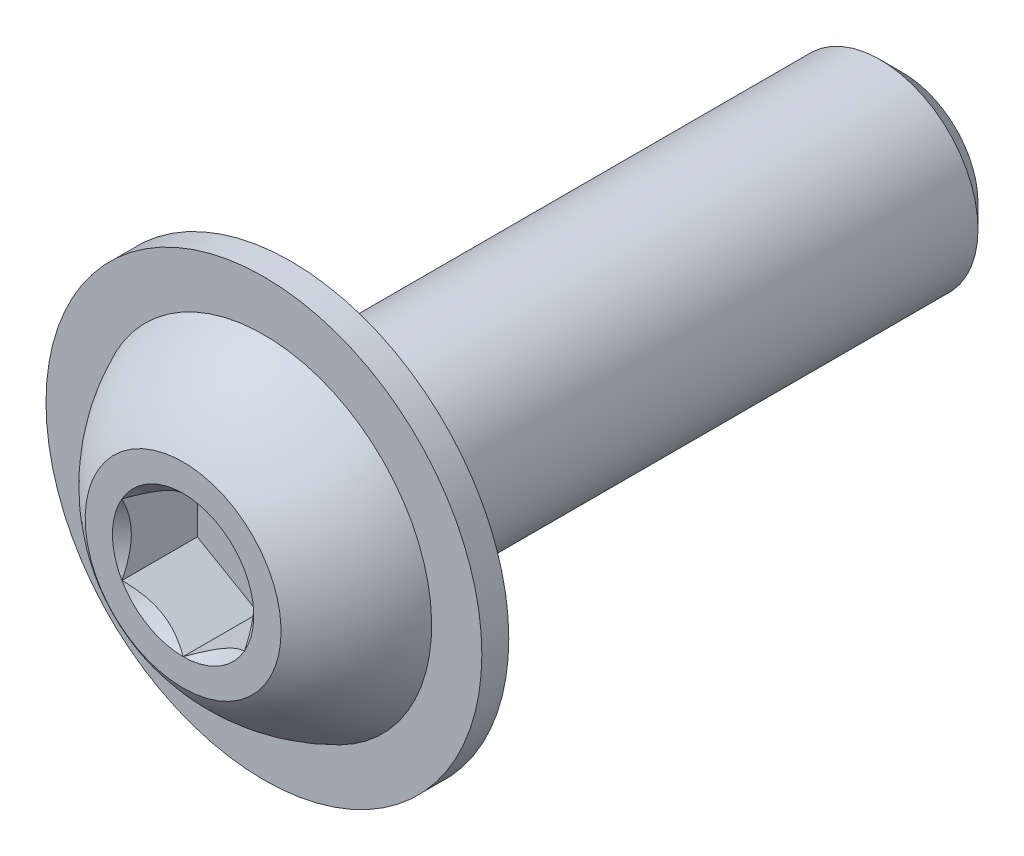
ISO-10303-21;
HEADER;
FILE_DESCRIPTION(('STEP AP214'),'2;1');
FILE_NAME('part.step','',(''),(''),'','','');
FILE_SCHEMA(('AUTOMOTIVE_DESIGN { 1 0 10303 214 1 1 1 1 }'));
ENDSEC;
DATA;
#1=APPLICATION_CONTEXT('core data for automotive mechanical design processes');
#2=APPLICATION_PROTOCOL_DEFINITION('international standard','automotive_design',2000,#1);
#3=PRODUCT_CONTEXT('',#1,'mechanical');
#4=PRODUCT('Part','Part','',(#3));
#5=PRODUCT_RELATED_PRODUCT_CATEGORY('part','',(#4));
#6=PRODUCT_DEFINITION_FORMATION('','',#4);
#7=PRODUCT_DEFINITION_CONTEXT('part definition',#1,'design');
#8=PRODUCT_DEFINITION('design','',#6,#7);
#9=PRODUCT_DEFINITION_SHAPE('','',#8);
#10=(LENGTH_UNIT() NAMED_UNIT(*) SI_UNIT(.MILLI.,.METRE.));
#11=(NAMED_UNIT(*) PLANE_ANGLE_UNIT() SI_UNIT($,.RADIAN.));
#12=(NAMED_UNIT(*) SI_UNIT($,.STERADIAN.) SOLID_ANGLE_UNIT());
#13=UNCERTAINTY_MEASURE_WITH_UNIT(LENGTH_MEASURE(1.E-05),#10,'distance_accuracy_value','');
#14=(GEOMETRIC_REPRESENTATION_CONTEXT(3) GLOBAL_UNCERTAINTY_ASSIGNED_CONTEXT((#13)) GLOBAL_UNIT_ASSIGNED_CONTEXT((#10,
#11,#12)) REPRESENTATION_CONTEXT('',''));
#15=CARTESIAN_POINT('',(0.,0.,0.));
#16=DIRECTION('',(0.,0.,1.));
#17=DIRECTION('',(1.,0.,0.));
#18=AXIS2_PLACEMENT_3D('',#15,#16,#17);
#19=CARTESIAN_POINT('',(0.,4.,-14.7));
#20=DIRECTION('',(0.,0.,1.));
#21=DIRECTION('',(1.,0.,0.));
#22=AXIS2_PLACEMENT_3D('',#19,#20,#21);
#23=PLANE('',#22);
#24=CARTESIAN_POINT('',(0.,0.,-14.7));
#25=DIRECTION('',(0.,0.,1.));
#26=DIRECTION('',(1.,0.,0.));
#27=AXIS2_PLACEMENT_3D('',#24,#25,#26);
#28=CIRCLE('',#27,3.0625);
#29=CARTESIAN_POINT('',(3.0625,0.,-14.7));
#30=VERTEX_POINT('',#29);
#31=EDGE_CURVE('E62',#30,#30,#28,.F.);
#32=ORIENTED_EDGE('',*,*,#31,.T.);
#33=EDGE_LOOP('',(#32));
#34=FACE_BOUND('',#33,.T.);
#35=ADVANCED_FACE('F47',(#34),#23,.F.);
#36=CARTESIAN_POINT('',(0.,0.,14.7));
#37=DIRECTION('',(0.,0.,1.));
#38=DIRECTION('',(1.,0.,0.));
#39=AXIS2_PLACEMENT_3D('',#36,#37,#38);
#40=CYLINDRICAL_SURFACE('',#39,4.);
#41=CARTESIAN_POINT('',(0.,0.,-13.7625));
#42=DIRECTION('',(0.,0.,1.));
#43=DIRECTION('',(1.,0.,0.));
#44=AXIS2_PLACEMENT_3D('',#41,#42,#43);
#45=CIRCLE('',#44,4.);
#46=CARTESIAN_POINT('',(4.,0.,-13.7625));
#47=VERTEX_POINT('',#46);
#48=EDGE_CURVE('E216',#47,#47,#45,.T.);
#49=ORIENTED_EDGE('',*,*,#48,.T.);
#50=EDGE_LOOP('',(#49));
#51=FACE_BOUND('',#50,.T.);
#52=CARTESIAN_POINT('',(0.,0.,10.3));
#53=DIRECTION('',(0.,0.,1.));
#54=DIRECTION('',(1.,0.,0.));
#55=AXIS2_PLACEMENT_3D('',#52,#53,#54);
#56=CIRCLE('',#55,4.);
#57=CARTESIAN_POINT('',(4.,0.,10.3));
#58=VERTEX_POINT('',#57);
#59=EDGE_CURVE('E212',#58,#58,#56,.T.);
#60=ORIENTED_EDGE('',*,*,#59,.F.);
#61=EDGE_LOOP('',(#60));
#62=FACE_BOUND('',#61,.T.);
#63=ADVANCED_FACE('F227',(#51,#62),#40,.T.);
#64=CARTESIAN_POINT('',(0.,0.,-13.7625));
#65=DIRECTION('',(0.,0.,1.));
#66=DIRECTION('',(1.,0.,0.));
#67=AXIS2_PLACEMENT_3D('',#64,#65,#66);
#68=CONICAL_SURFACE('',#67,4.,0.78539816339745);
#69=ORIENTED_EDGE('',*,*,#31,.F.);
#70=EDGE_LOOP('',(#69));
#71=FACE_BOUND('',#70,.T.);
#72=ORIENTED_EDGE('',*,*,#48,.F.);
#73=EDGE_LOOP('',(#72));
#74=FACE_BOUND('',#73,.T.);
#75=ADVANCED_FACE('F49',(#71,#74),#68,.T.);
#76=CARTESIAN_POINT('',(0.,-8.9,10.3));
#77=DIRECTION('',(0.,0.,1.));
#78=DIRECTION('',(0.,-1.,0.));
#79=AXIS2_PLACEMENT_3D('',#76,#77,#78);
#80=PLANE('',#79);
#81=CARTESIAN_POINT('',(0.,0.,10.3));
#82=DIRECTION('',(0.,0.,1.));
#83=DIRECTION('',(0.,-1.,0.));
#84=AXIS2_PLACEMENT_3D('',#81,#82,#83);
#85=CIRCLE('',#84,8.9);
#86=CARTESIAN_POINT('',(0.,-8.9,10.3));
#87=VERTEX_POINT('',#86);
#88=EDGE_CURVE('E204',#87,#87,#85,.T.);
#89=ORIENTED_EDGE('',*,*,#88,.F.);
#90=EDGE_LOOP('',(#89));
#91=FACE_BOUND('',#90,.T.);
#92=ORIENTED_EDGE('',*,*,#59,.T.);
#93=EDGE_LOOP('',(#92));
#94=FACE_BOUND('',#93,.T.);
#95=ADVANCED_FACE('F226',(#91,#94),#80,.F.);
#96=CARTESIAN_POINT('',(0.,0.,8.36477272727273));
#97=DIRECTION('',(0.,0.,1.));
#98=DIRECTION('',(0.,-1.,0.));
#99=AXIS2_PLACEMENT_3D('',#96,#97,#98);
#100=SPHERICAL_SURFACE('',#99,7.49233639108038);
#101=CARTESIAN_POINT('',(0.,0.,14.7));
#102=DIRECTION('',(0.,0.,1.));
#103=DIRECTION('',(0.,-1.,0.));
#104=AXIS2_PLACEMENT_3D('',#101,#102,#103);
#105=CIRCLE('',#104,4.);
#106=CARTESIAN_POINT('',(0.,-4.,14.7));
#107=VERTEX_POINT('',#106);
#108=EDGE_CURVE('E208',#107,#107,#105,.T.);
#109=CARTESIAN_POINT('',(0.,0.,11.4));
#110=DIRECTION('',(0.,0.,1.));
#111=DIRECTION('',(0.,-1.,0.));
#112=AXIS2_PLACEMENT_3D('',#109,#110,#111);
#113=CIRCLE('',#112,6.85);
#114=CARTESIAN_POINT('',(0.,-6.85,11.4));
#115=VERTEX_POINT('',#114);
#116=EDGE_CURVE('E196',#115,#115,#113,.T.);
#117=CARTESIAN_POINT('',(0.,-4.,14.7));
#118=CARTESIAN_POINT('',(0.,-4.03896925899167,14.675395255813));
#119=CARTESIAN_POINT('',(0.,-4.07771143871572,14.6504308650469));
#120=CARTESIAN_POINT('',(0.,-4.15472857241435,14.5997914822059));
#121=CARTESIAN_POINT('',(0.,-4.19300352638891,14.5741164901311));
#122=CARTESIAN_POINT('',(0.,-4.2690731413743,14.5220645965225));
#123=CARTESIAN_POINT('',(0.,-4.30686780238512,14.4956876949888));
#124=CARTESIAN_POINT('',(0.,-4.38196397041198,14.4422409781677));
#125=CARTESIAN_POINT('',(0.,-4.41926547742802,14.4151711628803));
#126=CARTESIAN_POINT('',(0.,-4.49336263294272,14.3603478328389));
#127=CARTESIAN_POINT('',(0.,-4.53015828144137,14.3325943180849));
#128=CARTESIAN_POINT('',(0.,-4.60323119071712,14.2764130408691));
#129=CARTESIAN_POINT('',(0.,-4.63950845149421,14.2479852784074));
#130=CARTESIAN_POINT('',(0.,-4.71153223182666,14.1904651858863));
#131=CARTESIAN_POINT('',(0.,-4.74727875138204,14.161372855827));
#132=CARTESIAN_POINT('',(0.,-4.8182288767215,14.1025335348572));
#133=CARTESIAN_POINT('',(0.,-4.85343248250559,14.0727865439467));
#134=CARTESIAN_POINT('',(0.,-4.92328479256995,14.0126480308601));
#135=CARTESIAN_POINT('',(0.,-4.95793349685022,13.9822565086839));
#136=CARTESIAN_POINT('',(0.,-5.02666420514821,13.9208392821547));
#137=CARTESIAN_POINT('',(0.,-5.06074620916592,13.8898135778016));
#138=CARTESIAN_POINT('',(0.,-5.12833191115163,13.827138551956));
#139=CARTESIAN_POINT('',(0.,-5.16183560911962,13.7954892304633));
#140=CARTESIAN_POINT('',(0.,-5.22825329014773,13.7315777477352));
#141=CARTESIAN_POINT('',(0.,-5.26116727320785,13.6993155864996));
#142=CARTESIAN_POINT('',(0.,-5.32639431637462,13.6341894103691));
#143=CARTESIAN_POINT('',(0.,-5.35870737648127,13.6013253954741));
#144=CARTESIAN_POINT('',(0.,-5.42272157032509,13.5350067030549));
#145=CARTESIAN_POINT('',(0.,-5.45442270406226,13.5015520255307));
#146=CARTESIAN_POINT('',(0.,-5.51720225012754,13.4340634000187));
#147=CARTESIAN_POINT('',(0.,-5.54828066245565,13.4000294520309));
#148=CARTESIAN_POINT('',(0.,-5.60980418271563,13.3313938750137));
#149=CARTESIAN_POINT('',(0.,-5.64024929064751,13.2967922459843));
#150=CARTESIAN_POINT('',(0.,-5.70049583478407,13.2270330896157));
#151=CARTESIAN_POINT('',(0.,-5.73029727098875,13.1918755622764));
#152=CARTESIAN_POINT('',(0.,-5.7892463235265,13.1210165813173));
#153=CARTESIAN_POINT('',(0.,-5.81839393985956,13.0853151276974));
#154=CARTESIAN_POINT('',(0.,-5.87602542715189,13.0133804514269));
#155=CARTESIAN_POINT('',(0.,-5.90450929811115,12.9771472287763));
#156=CARTESIAN_POINT('',(0.,-5.96080359517582,12.9041613527752));
#157=CARTESIAN_POINT('',(0.,-5.98861402128122,12.8674086994246));
#158=CARTESIAN_POINT('',(0.,-6.04355195848312,12.7933964772335));
#159=CARTESIAN_POINT('',(0.,-6.07067946957962,12.756136908393));
#160=CARTESIAN_POINT('',(0.,-6.12424233915867,12.6811235430497));
#161=CARTESIAN_POINT('',(0.,-6.15067769764121,12.643369746547));
#162=CARTESIAN_POINT('',(0.,-6.20284726008234,12.5673807820037));
#163=CARTESIAN_POINT('',(0.,-6.22858146404091,12.5291456139632));
#164=CARTESIAN_POINT('',(0.,-6.2793399542868,12.4522069263889));
#165=CARTESIAN_POINT('',(0.,-6.30436424057411,12.4135034068553));
#166=CARTESIAN_POINT('',(0.,-6.3536943740682,12.3356411958216));
#167=CARTESIAN_POINT('',(0.,-6.37800022127497,12.2964825043216));
#168=CARTESIAN_POINT('',(0.,-6.42588519987143,12.2177232838919));
#169=CARTESIAN_POINT('',(0.,-6.44946433126112,12.1781227549622));
#170=CARTESIAN_POINT('',(0.,-6.49588784885487,12.0984933446214));
#171=CARTESIAN_POINT('',(0.,-6.51873223505892,12.0584644632102));
#172=CARTESIAN_POINT('',(0.,-6.56367848347487,11.9779919788882));
#173=CARTESIAN_POINT('',(0.,-6.58578034568675,11.9375483759774));
#174=CARTESIAN_POINT('',(0.,-6.62923401880661,11.8562602202314));
#175=CARTESIAN_POINT('',(0.,-6.65058582971459,11.8154156673962));
#176=CARTESIAN_POINT('',(0.,-6.69253213337748,11.7333395222608));
#177=CARTESIAN_POINT('',(0.,-6.71312662613239,11.6921079299605));
#178=CARTESIAN_POINT('',(0.,-6.75355126567507,11.6092717393787));
#179=CARTESIAN_POINT('',(0.,-6.77338141246284,11.5676671410971));
#180=CARTESIAN_POINT('',(0.,-6.812270662889,11.4840991317936));
#181=CARTESIAN_POINT('',(0.,-6.8313297665274,11.4421357207716));
#182=CARTESIAN_POINT('',(0.,-6.85,11.4));
#183=B_SPLINE_CURVE_WITH_KNOTS('',3,(#117,#118,#119,#120,#121,#122,#123,#124,#125,#126,#127,
#128,#129,#130,#131,#132,#133,#134,#135,#136,#137,#138,#139,#140,#141,#142,#143,#144,#145,#146,
#147,#148,#149,#150,#151,#152,#153,#154,#155,#156,#157,#158,#159,#160,#161,#162,#163,#164,#165,
#166,#167,#168,#169,#170,#171,#172,#173,#174,#175,#176,#177,#178,#179,#180,#181,#182),
.UNSPECIFIED.,.F.,.F.,(4,2,2,2,2,2,2,2,2,2,2,2,2,2,2,2,2,2,2,2,2,2,2,2,2,2,2,2,2,2,2,2,4),(0.,
0.138258547689302,0.276517095378603,0.414775643067903,0.553034190757204,0.691292738446505,
0.829551286135806,0.967809833825107,1.10606838151441,1.24432692920371,1.38258547689301,
1.52084402458231,1.65910257227161,1.79736111996091,1.93561966765022,2.07387821533951,
2.21213676302882,2.35039531071812,2.48865385840742,2.62691240609672,2.76517095378602,
2.90342950147532,3.04168804916462,3.17994659685392,3.31820514454322,3.45646369223252,
3.59472223992183,3.73298078761113,3.87123933530043,4.00949788298973,4.14775643067903,
4.28601497836833,4.42427352605763),.UNSPECIFIED.);
#184=EDGE_CURVE('BSEAM236',#107,#115,#183,.T.);
#185=ORIENTED_EDGE('',*,*,#108,.F.);
#186=ORIENTED_EDGE('',*,*,#116,.T.);
#187=ORIENTED_EDGE('',*,*,#184,.T.);
#188=ORIENTED_EDGE('',*,*,#184,.F.);
#189=EDGE_LOOP('',(#185,#187,#186,#188));
#190=FACE_BOUND('',#189,.T.);
#191=ADVANCED_FACE('F236',(#190),#100,.T.);
#192=CARTESIAN_POINT('',(0.,-4.,14.7));
#193=DIRECTION('',(0.,0.,-1.));
#194=DIRECTION('',(0.,1.,0.));
#195=AXIS2_PLACEMENT_3D('',#192,#193,#194);
#196=PLANE('',#195);
#197=CARTESIAN_POINT('',(0.,0.,14.7));
#198=DIRECTION('',(0.,0.,1.));
#199=DIRECTION('',(1.,0.,0.));
#200=AXIS2_PLACEMENT_3D('',#197,#198,#199);
#201=CIRCLE('',#200,2.88675134594813);
#202=CARTESIAN_POINT('',(0.,2.88675134594813,14.7));
#203=VERTEX_POINT('',#202);
#204=CARTESIAN_POINT('',(-2.5,1.44337567297406,14.7));
#205=VERTEX_POINT('',#204);
#206=EDGE_CURVE('E153',#203,#205,#201,.T.);
#207=ORIENTED_EDGE('',*,*,#206,.F.);
#208=CARTESIAN_POINT('',(2.5,1.44337567297406,14.7));
#209=VERTEX_POINT('',#208);
#210=EDGE_CURVE('E148',#209,#203,#201,.T.);
#211=ORIENTED_EDGE('',*,*,#210,.F.);
#212=CARTESIAN_POINT('',(2.5,-1.44337567297407,14.7));
#213=VERTEX_POINT('',#212);
#214=EDGE_CURVE('E116',#213,#209,#201,.T.);
#215=ORIENTED_EDGE('',*,*,#214,.F.);
#216=CARTESIAN_POINT('',(0.,-2.88675134594813,14.7));
#217=VERTEX_POINT('',#216);
#218=EDGE_CURVE('E107',#217,#213,#201,.T.);
#219=ORIENTED_EDGE('',*,*,#218,.F.);
#220=CARTESIAN_POINT('',(-2.5,-1.44337567297407,14.7));
#221=VERTEX_POINT('',#220);
#222=EDGE_CURVE('E68',#221,#217,#201,.T.);
#223=ORIENTED_EDGE('',*,*,#222,.F.);
#224=EDGE_CURVE('E75',#205,#221,#201,.T.);
#225=ORIENTED_EDGE('',*,*,#224,.F.);
#226=EDGE_LOOP('',(#207,#211,#215,#219,#223,#225));
#227=FACE_BOUND('',#226,.T.);
#228=ORIENTED_EDGE('',*,*,#108,.T.);
#229=EDGE_LOOP('',(#228));
#230=FACE_BOUND('',#229,.T.);
#231=ADVANCED_FACE('F145',(#227,#230),#196,.F.);
#232=CARTESIAN_POINT('',(0.,0.,14.7));
#233=DIRECTION('',(0.,0.,1.));
#234=DIRECTION('',(0.,-1.,0.));
#235=AXIS2_PLACEMENT_3D('',#232,#233,#234);
#236=CYLINDRICAL_SURFACE('',#235,8.9);
#237=CARTESIAN_POINT('',(0.,0.,11.4));
#238=DIRECTION('',(0.,0.,1.));
#239=DIRECTION('',(0.,-1.,0.));
#240=AXIS2_PLACEMENT_3D('',#237,#238,#239);
#241=CIRCLE('',#240,8.9);
#242=CARTESIAN_POINT('',(0.,-8.9,11.4));
#243=VERTEX_POINT('',#242);
#244=EDGE_CURVE('E200',#243,#243,#241,.T.);
#245=ORIENTED_EDGE('',*,*,#244,.F.);
#246=EDGE_LOOP('',(#245));
#247=FACE_BOUND('',#246,.T.);
#248=ORIENTED_EDGE('',*,*,#88,.T.);
#249=EDGE_LOOP('',(#248));
#250=FACE_BOUND('',#249,.T.);
#251=ADVANCED_FACE('F251',(#247,#250),#236,.T.);
#252=CARTESIAN_POINT('',(0.,-6.85,11.4));
#253=DIRECTION('',(0.,0.,-1.));
#254=DIRECTION('',(0.,1.,0.));
#255=AXIS2_PLACEMENT_3D('',#252,#253,#254);
#256=PLANE('',#255);
#257=ORIENTED_EDGE('',*,*,#116,.F.);
#258=EDGE_LOOP('',(#257));
#259=FACE_BOUND('',#258,.T.);
#260=ORIENTED_EDGE('',*,*,#244,.T.);
#261=EDGE_LOOP('',(#260));
#262=FACE_BOUND('',#261,.T.);
#263=ADVANCED_FACE('F257',(#259,#262),#256,.F.);
#264=CARTESIAN_POINT('',(0.,0.,14.7));
#265=DIRECTION('',(0.,0.,1.));
#266=DIRECTION('',(1.,0.,0.));
#267=AXIS2_PLACEMENT_3D('',#264,#265,#266);
#268=CONICAL_SURFACE('',#267,2.88675134594813,0.78539816339745);
#269=ORIENTED_EDGE('',*,*,#214,.T.);
#270=CARTESIAN_POINT('',(2.5,-2.87868021616154,15.6259641937847));
#271=CARTESIAN_POINT('',(2.5,-2.80858751756355,15.5730547693995));
#272=CARTESIAN_POINT('',(2.5,-2.73810237384457,15.5206567848064));
#273=CARTESIAN_POINT('',(2.5,-2.59619238907469,15.4171126835152));
#274=CARTESIAN_POINT('',(2.5,-2.52476731657143,15.3659668843779));
#275=CARTESIAN_POINT('',(2.5,-2.38030019419698,15.2647924979814));
#276=CARTESIAN_POINT('',(2.5,-2.30724990359399,15.2147756377845));
#277=CARTESIAN_POINT('',(2.5,-2.15990937397294,15.1166088439155));
#278=CARTESIAN_POINT('',(2.5,-2.08561922308943,15.0684587783455));
#279=CARTESIAN_POINT('',(2.5,-1.93130274871408,14.971746559452));
#280=CARTESIAN_POINT('',(2.5,-1.8511916849785,14.9233189325373));
#281=CARTESIAN_POINT('',(2.5,-1.68912282627168,14.8296640597041));
#282=CARTESIAN_POINT('',(2.5,-1.60716527674864,14.7844363916948));
#283=CARTESIAN_POINT('',(2.5,-1.44137668632319,14.6981353746693));
#284=CARTESIAN_POINT('',(2.5,-1.35755175925796,14.6570503726636));
#285=CARTESIAN_POINT('',(2.5,-1.1876157775942,14.5799618661066));
#286=CARTESIAN_POINT('',(2.5,-1.10150577924729,14.5439560607346));
#287=CARTESIAN_POINT('',(2.5,-0.933895283730373,14.4809497442851));
#288=CARTESIAN_POINT('',(2.5,-0.852581486652411,14.4534577201431));
#289=CARTESIAN_POINT('',(2.5,-0.687996185051424,14.4049971144174));
#290=CARTESIAN_POINT('',(2.5,-0.604724546085161,14.384028982239));
#291=CARTESIAN_POINT('',(2.5,-0.438105786501648,14.350059995013));
#292=CARTESIAN_POINT('',(2.5,-0.35478695737788,14.3369226334436));
#293=CARTESIAN_POINT('',(2.5,-0.18725863826877,14.3188701943996));
#294=CARTESIAN_POINT('',(2.5,-0.103049303891731,14.3139537035302));
#295=CARTESIAN_POINT('',(2.5,0.0623819458555511,14.3127080743719));
#296=CARTESIAN_POINT('',(2.5,0.143601667742496,14.3160745517109));
#297=CARTESIAN_POINT('',(2.5,0.305344840533966,14.3305375923809));
#298=CARTESIAN_POINT('',(2.5,0.385868223029659,14.3416349066531));
#299=CARTESIAN_POINT('',(2.5,0.546999992477732,14.3711420785853));
#300=CARTESIAN_POINT('',(2.5,0.627585258156381,14.3896763768309));
#301=CARTESIAN_POINT('',(2.5,0.786991930978589,14.4330723320141));
#302=CARTESIAN_POINT('',(2.5,0.865813485110826,14.4579334595174));
#303=CARTESIAN_POINT('',(2.5,1.11399280220491,14.5455589112399));
#304=CARTESIAN_POINT('',(2.5,1.27984027529456,14.6183033354746));
#305=CARTESIAN_POINT('',(2.5,1.52253018655039,14.7395423452678));
#306=CARTESIAN_POINT('',(2.5,1.60256472908879,14.7820714512072));
#307=CARTESIAN_POINT('',(2.5,1.76081489282125,14.8703965241522));
#308=CARTESIAN_POINT('',(2.5,1.83903083842887,14.9161919024767));
#309=CARTESIAN_POINT('',(2.5,1.99000684607168,15.0080446787287));
#310=CARTESIAN_POINT('',(2.5,2.06284472030445,15.0539756354245));
#311=CARTESIAN_POINT('',(2.5,2.20727164736135,15.1477702453865));
#312=CARTESIAN_POINT('',(2.5,2.27886060500402,15.1956340450436));
#313=CARTESIAN_POINT('',(2.5,2.42037078548403,15.2925522363183));
#314=CARTESIAN_POINT('',(2.5,2.49030083172878,15.3415937983162));
#315=CARTESIAN_POINT('',(2.5,2.62920524991558,15.4409738351898));
#316=CARTESIAN_POINT('',(2.5,2.6981798793784,15.4913119497074));
#317=CARTESIAN_POINT('',(2.5,2.76675463365824,15.5421802976824));
#318=B_SPLINE_CURVE_WITH_KNOTS('',3,(#270,#271,#272,#273,#274,#275,#276,#277,#278,#279,#280,
#281,#282,#283,#284,#285,#286,#287,#288,#289,#290,#291,#292,#293,#294,#295,#296,#297,#298,#299,
#300,#301,#302,#303,#304,#305,#306,#307,#308,#309,#310,#311,#312,#313,#314,#315,#316,#317),
.UNSPECIFIED.,.F.,.F.,(4,2,2,2,2,2,2,2,2,2,2,2,2,2,2,2,2,2,2,2,2,2,2,4),(0.,0.263465914971114,
0.526997968323237,0.792571943279361,1.05812711983771,1.33890112548018,1.61963802629079,
1.89956181222216,2.17935838571897,2.436638876826,2.69393708705248,2.94660788173135,
3.19923523085016,3.44271854486786,3.68622551313359,3.93398926860573,4.18173229781968,
4.72334004841908,4.99521600382014,5.26704308216966,5.52534341671993,5.78366335141086,
6.03988492204047,6.29603603207541),.UNSPECIFIED.);
#319=EDGE_CURVE('E11',#213,#209,#318,.T.);
#320=ORIENTED_EDGE('',*,*,#319,.F.);
#321=EDGE_LOOP('',(#269,#320));
#322=FACE_BOUND('',#321,.T.);
#323=ADVANCED_FACE('F120',(#322),#268,.F.);
#324=ORIENTED_EDGE('',*,*,#210,.T.);
#325=CARTESIAN_POINT('',(2.5002,1.44326020292023,14.7001154769818));
#326=CARTESIAN_POINT('',(2.41426172221224,1.49287669073468,14.6505407053547));
#327=CARTESIAN_POINT('',(2.32688643272425,1.5433228376411,14.6038774813625));
#328=CARTESIAN_POINT('',(2.14871854383441,1.64618811625259,14.5184381400383));
#329=CARTESIAN_POINT('',(2.05790899931893,1.69861703122359,14.479709562406));
#330=CARTESIAN_POINT('',(1.87479587687308,1.80433744175986,14.4133667038977));
#331=CARTESIAN_POINT('',(1.78253893547066,1.85760201171315,14.3855856685309));
#332=CARTESIAN_POINT('',(1.59599399122371,1.96530378549009,14.3427831759107));
#333=CARTESIAN_POINT('',(1.50171168743372,2.01973769896307,14.3277297666713));
#334=CARTESIAN_POINT('',(1.33922174170815,2.11355131286833,14.3141477222095));
#335=CARTESIAN_POINT('',(1.27122403211985,2.15280980880341,14.3121370992408));
#336=CARTESIAN_POINT('',(1.13533975883078,2.23126263056549,14.3155241171875));
#337=CARTESIAN_POINT('',(1.06745324244776,2.27045692907358,14.3209243552998));
#338=CARTESIAN_POINT('',(0.932321211763893,2.34847544336505,14.3388257884025));
#339=CARTESIAN_POINT('',(0.865076500246438,2.38729919566123,14.3513349270465));
#340=CARTESIAN_POINT('',(0.731749899181799,2.46427534467603,14.3827675019557));
#341=CARTESIAN_POINT('',(0.665667920900341,2.50242779262542,14.4016904464968));
#342=CARTESIAN_POINT('',(0.496403653308734,2.60015256308362,14.4578673614082));
#343=CARTESIAN_POINT('',(0.394270877777106,2.65911894852989,14.4993558315962));
#344=CARTESIAN_POINT('',(0.244093585059491,2.74582384890657,14.5693940467231));
#345=CARTESIAN_POINT('',(0.19460346011739,2.77439698586412,14.5940022521161));
#346=CARTESIAN_POINT('',(0.0965399361611532,2.83101398781794,14.6454618867152));
#347=CARTESIAN_POINT('',(0.0479659965030721,2.85905816495513,14.6723119387794));
#348=CARTESIAN_POINT('',(-0.00019999999999999,2.88686681600197,14.7001154769818));
#349=B_SPLINE_CURVE_WITH_KNOTS('',3,(#325,#326,#327,#328,#329,#330,#331,#332,#333,#334,#335,
#336,#337,#338,#339,#340,#341,#342,#343,#344,#345,#346,#347,#348),.UNSPECIFIED.,.F.,.F.,(4,2,2,
2,2,2,2,2,2,2,2,4),(0.,0.333012085133924,0.667964518301398,0.997597032043301,1.32639954393845,
1.56169424147169,1.79707142102083,2.03271213522171,2.26833478775651,2.64260240809533,
2.82922877818864,3.01574133749025),.UNSPECIFIED.);
#350=EDGE_CURVE('E152',#209,#203,#349,.T.);
#351=ORIENTED_EDGE('',*,*,#350,.F.);
#352=EDGE_LOOP('',(#324,#351));
#353=FACE_BOUND('',#352,.T.);
#354=ADVANCED_FACE('F347',(#353),#268,.F.);
#355=ORIENTED_EDGE('',*,*,#206,.T.);
#356=CARTESIAN_POINT('',(0.000199999999999368,2.88686681600197,14.7001154769818));
#357=CARTESIAN_POINT('',(-0.0857382777877653,2.83725032818751,14.6505407053547));
#358=CARTESIAN_POINT('',(-0.173113567275754,2.7868041812811,14.6038774813625));
#359=CARTESIAN_POINT('',(-0.351281456165589,2.6839389026696,14.5184381400383));
#360=CARTESIAN_POINT('',(-0.442091000681076,2.6315099876986,14.479709562406));
#361=CARTESIAN_POINT('',(-0.625204123126922,2.52578957716234,14.4133667038977));
#362=CARTESIAN_POINT('',(-0.717461064529341,2.47252500720904,14.3855856685309));
#363=CARTESIAN_POINT('',(-0.904006008776286,2.3648232334321,14.3427831759107));
#364=CARTESIAN_POINT('',(-0.998288312566284,2.31038931995913,14.3277297666713));
#365=CARTESIAN_POINT('',(-1.16077825829185,2.21657570605387,14.3141477222095));
#366=CARTESIAN_POINT('',(-1.22877596788015,2.17731721011878,14.3121370992408));
#367=CARTESIAN_POINT('',(-1.36466024116922,2.0988643883567,14.3155241171875));
#368=CARTESIAN_POINT('',(-1.43254675755224,2.05967008984862,14.3209243552998));
#369=CARTESIAN_POINT('',(-1.56767878823611,1.98165157555715,14.3388257884025));
#370=CARTESIAN_POINT('',(-1.63492349975356,1.94282782326096,14.3513349270465));
#371=CARTESIAN_POINT('',(-1.7682501008182,1.86585167424616,14.3827675019557));
#372=CARTESIAN_POINT('',(-1.83433207909966,1.82769922629678,14.4016904464968));
#373=CARTESIAN_POINT('',(-2.00359634669126,1.72997445583858,14.4578673614082));
#374=CARTESIAN_POINT('',(-2.10572912222289,1.67100807039231,14.4993558315962));
#375=CARTESIAN_POINT('',(-2.25590641494051,1.58430317001562,14.5693940467231));
#376=CARTESIAN_POINT('',(-2.30539653988261,1.55573003305807,14.5940022521161));
#377=CARTESIAN_POINT('',(-2.40346006383885,1.49911303110425,14.6454618867152));
#378=CARTESIAN_POINT('',(-2.45203400349693,1.47106885396706,14.6723119387794));
#379=CARTESIAN_POINT('',(-2.5002,1.44326020292022,14.7001154769818));
#380=B_SPLINE_CURVE_WITH_KNOTS('',3,(#356,#357,#358,#359,#360,#361,#362,#363,#364,#365,#366,
#367,#368,#369,#370,#371,#372,#373,#374,#375,#376,#377,#378,#379),.UNSPECIFIED.,.F.,.F.,(4,2,2,
2,2,2,2,2,2,2,2,4),(0.,0.333012085133924,0.667964518301397,0.997597032043298,1.32639954393844,
1.56169424147169,1.79707142102083,2.03271213522171,2.26833478775651,2.64260240809533,
2.82922877818864,3.01574133749025),.UNSPECIFIED.);
#381=EDGE_CURVE('E158',#203,#205,#380,.T.);
#382=ORIENTED_EDGE('',*,*,#381,.F.);
#383=EDGE_LOOP('',(#355,#382));
#384=FACE_BOUND('',#383,.T.);
#385=ADVANCED_FACE('F163',(#384),#268,.F.);
#386=ORIENTED_EDGE('',*,*,#224,.T.);
#387=CARTESIAN_POINT('',(-2.5,-2.87868021616154,15.6259641937847));
#388=CARTESIAN_POINT('',(-2.5,-2.80858751756355,15.5730547693995));
#389=CARTESIAN_POINT('',(-2.5,-2.73810237384458,15.5206567848064));
#390=CARTESIAN_POINT('',(-2.5,-2.59619238907469,15.4171126835152));
#391=CARTESIAN_POINT('',(-2.5,-2.52476731657143,15.3659668843779));
#392=CARTESIAN_POINT('',(-2.5,-2.38030019419698,15.2647924979814));
#393=CARTESIAN_POINT('',(-2.5,-2.30724990359399,15.2147756377845));
#394=CARTESIAN_POINT('',(-2.5,-2.15990937397294,15.1166088439155));
#395=CARTESIAN_POINT('',(-2.5,-2.08561922308943,15.0684587783455));
#396=CARTESIAN_POINT('',(-2.5,-1.93130274871409,14.971746559452));
#397=CARTESIAN_POINT('',(-2.5,-1.8511916849785,14.9233189325373));
#398=CARTESIAN_POINT('',(-2.5,-1.68912282627168,14.8296640597041));
#399=CARTESIAN_POINT('',(-2.5,-1.60716527674864,14.7844363916948));
#400=CARTESIAN_POINT('',(-2.5,-1.44137668632319,14.6981353746693));
#401=CARTESIAN_POINT('',(-2.5,-1.35755175925796,14.6570503726636));
#402=CARTESIAN_POINT('',(-2.5,-1.1876157775942,14.5799618661066));
#403=CARTESIAN_POINT('',(-2.5,-1.10150577924729,14.5439560607346));
#404=CARTESIAN_POINT('',(-2.5,-0.933895283730373,14.4809497442851));
#405=CARTESIAN_POINT('',(-2.5,-0.852581486652411,14.4534577201431));
#406=CARTESIAN_POINT('',(-2.5,-0.687996185051425,14.4049971144174));
#407=CARTESIAN_POINT('',(-2.5,-0.604724546085162,14.384028982239));
#408=CARTESIAN_POINT('',(-2.5,-0.438105786501648,14.350059995013));
#409=CARTESIAN_POINT('',(-2.5,-0.35478695737788,14.3369226334436));
#410=CARTESIAN_POINT('',(-2.5,-0.187258638268771,14.3188701943996));
#411=CARTESIAN_POINT('',(-2.5,-0.103049303891732,14.3139537035302));
#412=CARTESIAN_POINT('',(-2.5,0.06238194585555,14.3127080743719));
#413=CARTESIAN_POINT('',(-2.5,0.143601667742495,14.3160745517109));
#414=CARTESIAN_POINT('',(-2.5,0.305344840533965,14.3305375923809));
#415=CARTESIAN_POINT('',(-2.5,0.385868223029658,14.3416349066531));
#416=CARTESIAN_POINT('',(-2.5,0.546999992477731,14.3711420785853));
#417=CARTESIAN_POINT('',(-2.5,0.62758525815638,14.3896763768309));
#418=CARTESIAN_POINT('',(-2.5,0.786991930978587,14.4330723320141));
#419=CARTESIAN_POINT('',(-2.5,0.865813485110825,14.4579334595174));
#420=CARTESIAN_POINT('',(-2.5,1.11399280220491,14.5455589112399));
#421=CARTESIAN_POINT('',(-2.5,1.27984027529456,14.6183033354746));
#422=CARTESIAN_POINT('',(-2.5,1.52253018655038,14.7395423452678));
#423=CARTESIAN_POINT('',(-2.5,1.60256472908879,14.7820714512072));
#424=CARTESIAN_POINT('',(-2.5,1.76081489282124,14.8703965241522));
#425=CARTESIAN_POINT('',(-2.5,1.83903083842886,14.9161919024767));
#426=CARTESIAN_POINT('',(-2.5,1.99000684607167,15.0080446787287));
#427=CARTESIAN_POINT('',(-2.5,2.06284472030444,15.0539756354245));
#428=CARTESIAN_POINT('',(-2.5,2.20727164736135,15.1477702453865));
#429=CARTESIAN_POINT('',(-2.5,2.27886060500402,15.1956340450436));
#430=CARTESIAN_POINT('',(-2.5,2.42037078548403,15.2925522363183));
#431=CARTESIAN_POINT('',(-2.5,2.49030083172878,15.3415937983162));
#432=CARTESIAN_POINT('',(-2.5,2.62920524991558,15.4409738351898));
#433=CARTESIAN_POINT('',(-2.5,2.69817987937839,15.4913119497074));
#434=CARTESIAN_POINT('',(-2.5,2.76675463365823,15.5421802976824));
#435=B_SPLINE_CURVE_WITH_KNOTS('',3,(#387,#388,#389,#390,#391,#392,#393,#394,#395,#396,#397,
#398,#399,#400,#401,#402,#403,#404,#405,#406,#407,#408,#409,#410,#411,#412,#413,#414,#415,#416,
#417,#418,#419,#420,#421,#422,#423,#424,#425,#426,#427,#428,#429,#430,#431,#432,#433,#434),
.UNSPECIFIED.,.F.,.F.,(4,2,2,2,2,2,2,2,2,2,2,2,2,2,2,2,2,2,2,2,2,2,2,4),(0.,0.263465914971116,
0.526997968323239,0.792571943279362,1.05812711983771,1.33890112548018,1.61963802629079,
1.89956181222216,2.17935838571897,2.436638876826,2.69393708705248,2.94660788173135,
3.19923523085016,3.44271854486786,3.68622551313359,3.93398926860573,4.18173229781968,
4.72334004841907,4.99521600382014,5.26704308216966,5.52534341671993,5.78366335141086,
6.03988492204046,6.29603603207541),.UNSPECIFIED.);
#436=EDGE_CURVE('E166',#205,#221,#435,.F.);
#437=ORIENTED_EDGE('',*,*,#436,.F.);
#438=EDGE_LOOP('',(#386,#437));
#439=FACE_BOUND('',#438,.T.);
#440=ADVANCED_FACE('F167',(#439),#268,.F.);
#441=ORIENTED_EDGE('',*,*,#222,.T.);
#442=CARTESIAN_POINT('',(-2.5002,-1.44326020292023,14.7001154769818));
#443=CARTESIAN_POINT('',(-2.41426172221224,-1.49287669073469,14.6505407053547));
#444=CARTESIAN_POINT('',(-2.32688643272425,-1.5433228376411,14.6038774813625));
#445=CARTESIAN_POINT('',(-2.14871854383441,-1.64618811625259,14.5184381400383));
#446=CARTESIAN_POINT('',(-2.05790899931893,-1.6986170312236,14.479709562406));
#447=CARTESIAN_POINT('',(-1.87479587687308,-1.80433744175986,14.4133667038977));
#448=CARTESIAN_POINT('',(-1.78253893547066,-1.85760201171316,14.3855856685309));
#449=CARTESIAN_POINT('',(-1.59599399122372,-1.96530378549009,14.3427831759107));
#450=CARTESIAN_POINT('',(-1.50171168743372,-2.01973769896307,14.3277297666713));
#451=CARTESIAN_POINT('',(-1.33922174170816,-2.11355131286833,14.3141477222095));
#452=CARTESIAN_POINT('',(-1.27122403211985,-2.15280980880341,14.3121370992408));
#453=CARTESIAN_POINT('',(-1.13533975883078,-2.23126263056549,14.3155241171875));
#454=CARTESIAN_POINT('',(-1.06745324244776,-2.27045692907358,14.3209243552998));
#455=CARTESIAN_POINT('',(-0.932321211763895,-2.34847544336505,14.3388257884025));
#456=CARTESIAN_POINT('',(-0.86507650024644,-2.38729919566123,14.3513349270465));
#457=CARTESIAN_POINT('',(-0.731749899181802,-2.46427534467604,14.3827675019557));
#458=CARTESIAN_POINT('',(-0.665667920900344,-2.50242779262542,14.4016904464968));
#459=CARTESIAN_POINT('',(-0.496403653308736,-2.60015256308362,14.4578673614083));
#460=CARTESIAN_POINT('',(-0.394270877777108,-2.65911894852989,14.4993558315962));
#461=CARTESIAN_POINT('',(-0.244093585059492,-2.74582384890657,14.5693940467231));
#462=CARTESIAN_POINT('',(-0.194603460117391,-2.77439698586412,14.5940022521161));
#463=CARTESIAN_POINT('',(-0.0965399361611532,-2.83101398781794,14.6454618867152));
#464=CARTESIAN_POINT('',(-0.047965996503072,-2.85905816495513,14.6723119387794));
#465=CARTESIAN_POINT('',(0.000200000000000107,-2.88686681600197,14.7001154769818));
#466=B_SPLINE_CURVE_WITH_KNOTS('',3,(#442,#443,#444,#445,#446,#447,#448,#449,#450,#451,#452,
#453,#454,#455,#456,#457,#458,#459,#460,#461,#462,#463,#464,#465),.UNSPECIFIED.,.F.,.F.,(4,2,2,
2,2,2,2,2,2,2,2,4),(0.,0.333012085133924,0.667964518301397,0.997597032043299,1.32639954393844,
1.56169424147169,1.79707142102083,2.03271213522171,2.26833478775651,2.64260240809533,
2.82922877818864,3.01574133749025),.UNSPECIFIED.);
#467=EDGE_CURVE('E133',#221,#217,#466,.T.);
#468=ORIENTED_EDGE('',*,*,#467,.F.);
#469=EDGE_LOOP('',(#441,#468));
#470=FACE_BOUND('',#469,.T.);
#471=ADVANCED_FACE('F288',(#470),#268,.F.);
#472=ORIENTED_EDGE('',*,*,#218,.T.);
#473=CARTESIAN_POINT('',(-0.00019999999999988,-2.88686681600197,14.7001154769818));
#474=CARTESIAN_POINT('',(0.0857382777877646,-2.83725032818751,14.6505407053547));
#475=CARTESIAN_POINT('',(0.173113567275753,-2.7868041812811,14.6038774813625));
#476=CARTESIAN_POINT('',(0.351281456165589,-2.6839389026696,14.5184381400383));
#477=CARTESIAN_POINT('',(0.442091000681075,-2.6315099876986,14.479709562406));
#478=CARTESIAN_POINT('',(0.625204123126922,-2.52578957716234,14.4133667038977));
#479=CARTESIAN_POINT('',(0.717461064529341,-2.47252500720904,14.3855856685309));
#480=CARTESIAN_POINT('',(0.904006008776286,-2.3648232334321,14.3427831759107));
#481=CARTESIAN_POINT('',(0.998288312566284,-2.31038931995913,14.3277297666713));
#482=CARTESIAN_POINT('',(1.16077825829185,-2.21657570605387,14.3141477222095));
#483=CARTESIAN_POINT('',(1.22877596788015,-2.17731721011878,14.3121370992408));
#484=CARTESIAN_POINT('',(1.36466024116922,-2.0988643883567,14.3155241171875));
#485=CARTESIAN_POINT('',(1.43254675755224,-2.05967008984862,14.3209243552998));
#486=CARTESIAN_POINT('',(1.56767878823611,-1.98165157555715,14.3388257884025));
#487=CARTESIAN_POINT('',(1.63492349975356,-1.94282782326097,14.3513349270465));
#488=CARTESIAN_POINT('',(1.7682501008182,-1.86585167424616,14.3827675019557));
#489=CARTESIAN_POINT('',(1.83433207909966,-1.82769922629678,14.4016904464968));
#490=CARTESIAN_POINT('',(2.00359634669127,-1.72997445583858,14.4578673614082));
#491=CARTESIAN_POINT('',(2.10572912222289,-1.67100807039231,14.4993558315962));
#492=CARTESIAN_POINT('',(2.25590641494051,-1.58430317001562,14.5693940467231));
#493=CARTESIAN_POINT('',(2.30539653988261,-1.55573003305807,14.5940022521161));
#494=CARTESIAN_POINT('',(2.40346006383885,-1.49911303110426,14.6454618867152));
#495=CARTESIAN_POINT('',(2.45203400349693,-1.47106885396706,14.6723119387794));
#496=CARTESIAN_POINT('',(2.5002,-1.44326020292023,14.7001154769818));
#497=B_SPLINE_CURVE_WITH_KNOTS('',3,(#473,#474,#475,#476,#477,#478,#479,#480,#481,#482,#483,
#484,#485,#486,#487,#488,#489,#490,#491,#492,#493,#494,#495,#496),.UNSPECIFIED.,.F.,.F.,(4,2,2,
2,2,2,2,2,2,2,2,4),(0.,0.333012085133924,0.667964518301398,0.9975970320433,1.32639954393844,
1.56169424147169,1.79707142102083,2.03271213522171,2.26833478775651,2.64260240809533,
2.82922877818864,3.01574133749025),.UNSPECIFIED.);
#498=EDGE_CURVE('E111',#217,#213,#497,.T.);
#499=ORIENTED_EDGE('',*,*,#498,.F.);
#500=EDGE_LOOP('',(#472,#499));
#501=FACE_BOUND('',#500,.T.);
#502=ADVANCED_FACE('F109',(#501),#268,.F.);
#503=CARTESIAN_POINT('',(2.5,-1.44337567297407,11.62));
#504=DIRECTION('',(0.,0.,1.));
#505=DIRECTION('',(1.,0.,0.));
#506=AXIS2_PLACEMENT_3D('',#503,#504,#505);
#507=PLANE('',#506);
#508=DIRECTION('',(0.866025403784438,0.5,0.));
#509=VECTOR('',#508,1.);
#510=CARTESIAN_POINT('',(0.,-2.88675134594813,11.62));
#511=LINE('',#510,#509);
#512=CARTESIAN_POINT('',(0.,-2.88675134594813,11.62));
#513=VERTEX_POINT('',#512);
#514=CARTESIAN_POINT('',(2.5,-1.44337567297407,11.62));
#515=VERTEX_POINT('',#514);
#516=EDGE_CURVE('E132',#513,#515,#511,.T.);
#517=ORIENTED_EDGE('',*,*,#516,.T.);
#518=DIRECTION('',(0.,1.,0.));
#519=VECTOR('',#518,1.);
#520=CARTESIAN_POINT('',(2.5,-1.44337567297407,11.62));
#521=LINE('',#520,#519);
#522=CARTESIAN_POINT('',(2.5,1.44337567297406,11.62));
#523=VERTEX_POINT('',#522);
#524=EDGE_CURVE('E137',#515,#523,#521,.T.);
#525=ORIENTED_EDGE('',*,*,#524,.T.);
#526=DIRECTION('',(-0.866025403784439,0.5,0.));
#527=VECTOR('',#526,1.);
#528=CARTESIAN_POINT('',(2.5,1.44337567297406,11.62));
#529=LINE('',#528,#527);
#530=CARTESIAN_POINT('',(0.,2.88675134594813,11.62));
#531=VERTEX_POINT('',#530);
#532=EDGE_CURVE('E322',#523,#531,#529,.T.);
#533=ORIENTED_EDGE('',*,*,#532,.T.);
#534=DIRECTION('',(-0.866025403784438,-0.5,0.));
#535=VECTOR('',#534,1.);
#536=CARTESIAN_POINT('',(0.,2.88675134594813,11.62));
#537=LINE('',#536,#535);
#538=CARTESIAN_POINT('',(-2.5,1.44337567297406,11.62));
#539=VERTEX_POINT('',#538);
#540=EDGE_CURVE('E325',#531,#539,#537,.T.);
#541=ORIENTED_EDGE('',*,*,#540,.T.);
#542=DIRECTION('',(0.,-1.,0.));
#543=VECTOR('',#542,1.);
#544=CARTESIAN_POINT('',(-2.5,1.44337567297406,11.62));
#545=LINE('',#544,#543);
#546=CARTESIAN_POINT('',(-2.5,-1.44337567297407,11.62));
#547=VERTEX_POINT('',#546);
#548=EDGE_CURVE('E183',#539,#547,#545,.T.);
#549=ORIENTED_EDGE('',*,*,#548,.T.);
#550=DIRECTION('',(0.866025403784439,-0.5,0.));
#551=VECTOR('',#550,1.);
#552=CARTESIAN_POINT('',(-2.5,-1.44337567297407,11.62));
#553=LINE('',#552,#551);
#554=EDGE_CURVE('E141',#547,#513,#553,.T.);
#555=ORIENTED_EDGE('',*,*,#554,.T.);
#556=EDGE_LOOP('',(#517,#525,#533,#541,#549,#555));
#557=FACE_BOUND('',#556,.T.);
#558=ADVANCED_FACE('F287',(#557),#507,.T.);
#559=CARTESIAN_POINT('',(2.5,-1.44337567297407,11.62));
#560=DIRECTION('',(1.,0.,0.));
#561=DIRECTION('',(0.,0.,-1.));
#562=AXIS2_PLACEMENT_3D('',#559,#560,#561);
#563=PLANE('',#562);
#564=DIRECTION('',(0.,0.,1.));
#565=VECTOR('',#564,1.);
#566=CARTESIAN_POINT('',(2.5,-1.44337567297407,11.62));
#567=LINE('',#566,#565);
#568=EDGE_CURVE('E128',#515,#213,#567,.T.);
#569=ORIENTED_EDGE('',*,*,#568,.T.);
#570=ORIENTED_EDGE('',*,*,#319,.T.);
#571=DIRECTION('',(0.,0.,1.));
#572=VECTOR('',#571,1.);
#573=CARTESIAN_POINT('',(2.5,1.44337567297406,11.62));
#574=LINE('',#573,#572);
#575=EDGE_CURVE('E140',#523,#209,#574,.T.);
#576=ORIENTED_EDGE('',*,*,#575,.F.);
#577=ORIENTED_EDGE('',*,*,#524,.F.);
#578=EDGE_LOOP('',(#569,#570,#576,#577));
#579=FACE_BOUND('',#578,.T.);
#580=ADVANCED_FACE('F135',(#579),#563,.F.);
#581=CARTESIAN_POINT('',(2.5,1.44337567297406,11.62));
#582=DIRECTION('',(0.5,0.866025403784439,0.));
#583=DIRECTION('',(-0.866025403784439,0.5,0.));
#584=AXIS2_PLACEMENT_3D('',#581,#582,#583);
#585=PLANE('',#584);
#586=ORIENTED_EDGE('',*,*,#575,.T.);
#587=ORIENTED_EDGE('',*,*,#350,.T.);
#588=DIRECTION('',(0.,0.,1.));
#589=VECTOR('',#588,1.);
#590=CARTESIAN_POINT('',(0.,2.88675134594813,11.62));
#591=LINE('',#590,#589);
#592=EDGE_CURVE('E178',#531,#203,#591,.T.);
#593=ORIENTED_EDGE('',*,*,#592,.F.);
#594=ORIENTED_EDGE('',*,*,#532,.F.);
#595=EDGE_LOOP('',(#586,#587,#593,#594));
#596=FACE_BOUND('',#595,.T.);
#597=ADVANCED_FACE('F313',(#596),#585,.F.);
#598=CARTESIAN_POINT('',(0.,2.88675134594813,11.62));
#599=DIRECTION('',(-0.5,0.866025403784438,0.));
#600=DIRECTION('',(-0.866025403784439,-0.5,0.));
#601=AXIS2_PLACEMENT_3D('',#598,#599,#600);
#602=PLANE('',#601);
#603=ORIENTED_EDGE('',*,*,#592,.T.);
#604=ORIENTED_EDGE('',*,*,#381,.T.);
#605=DIRECTION('',(0.,0.,1.));
#606=VECTOR('',#605,1.);
#607=CARTESIAN_POINT('',(-2.5,1.44337567297406,11.62));
#608=LINE('',#607,#606);
#609=EDGE_CURVE('E176',#539,#205,#608,.T.);
#610=ORIENTED_EDGE('',*,*,#609,.F.);
#611=ORIENTED_EDGE('',*,*,#540,.F.);
#612=EDGE_LOOP('',(#603,#604,#610,#611));
#613=FACE_BOUND('',#612,.T.);
#614=ADVANCED_FACE('F174',(#613),#602,.F.);
#615=CARTESIAN_POINT('',(-2.5,1.44337567297406,11.62));
#616=DIRECTION('',(-1.,0.,0.));
#617=DIRECTION('',(0.,0.,1.));
#618=AXIS2_PLACEMENT_3D('',#615,#616,#617);
#619=PLANE('',#618);
#620=ORIENTED_EDGE('',*,*,#609,.T.);
#621=ORIENTED_EDGE('',*,*,#436,.T.);
#622=DIRECTION('',(0.,0.,1.));
#623=VECTOR('',#622,1.);
#624=CARTESIAN_POINT('',(-2.5,-1.44337567297407,11.62));
#625=LINE('',#624,#623);
#626=EDGE_CURVE('E186',#547,#221,#625,.T.);
#627=ORIENTED_EDGE('',*,*,#626,.F.);
#628=ORIENTED_EDGE('',*,*,#548,.F.);
#629=EDGE_LOOP('',(#620,#621,#627,#628));
#630=FACE_BOUND('',#629,.T.);
#631=ADVANCED_FACE('F181',(#630),#619,.F.);
#632=CARTESIAN_POINT('',(-2.5,-1.44337567297407,11.62));
#633=DIRECTION('',(-0.5,-0.866025403784439,0.));
#634=DIRECTION('',(0.866025403784439,-0.5,0.));
#635=AXIS2_PLACEMENT_3D('',#632,#633,#634);
#636=PLANE('',#635);
#637=ORIENTED_EDGE('',*,*,#626,.T.);
#638=ORIENTED_EDGE('',*,*,#467,.T.);
#639=DIRECTION('',(0.,0.,1.));
#640=VECTOR('',#639,1.);
#641=CARTESIAN_POINT('',(0.,-2.88675134594813,11.62));
#642=LINE('',#641,#640);
#643=EDGE_CURVE('E130',#513,#217,#642,.T.);
#644=ORIENTED_EDGE('',*,*,#643,.F.);
#645=ORIENTED_EDGE('',*,*,#554,.F.);
#646=EDGE_LOOP('',(#637,#638,#644,#645));
#647=FACE_BOUND('',#646,.T.);
#648=ADVANCED_FACE('F269',(#647),#636,.F.);
#649=CARTESIAN_POINT('',(0.,-2.88675134594813,11.62));
#650=DIRECTION('',(0.5,-0.866025403784438,0.));
#651=DIRECTION('',(0.866025403784439,0.5,0.));
#652=AXIS2_PLACEMENT_3D('',#649,#650,#651);
#653=PLANE('',#652);
#654=ORIENTED_EDGE('',*,*,#643,.T.);
#655=ORIENTED_EDGE('',*,*,#498,.T.);
#656=ORIENTED_EDGE('',*,*,#568,.F.);
#657=ORIENTED_EDGE('',*,*,#516,.F.);
#658=EDGE_LOOP('',(#654,#655,#656,#657));
#659=FACE_BOUND('',#658,.T.);
#660=ADVANCED_FACE('F126',(#659),#653,.F.);
#661=CLOSED_SHELL('',(#35,#63,#75,#95,#191,#231,#251,#263,#323,#354,#385,#440,#471,#502,#558,
#580,#597,#614,#631,#648,#660));
#662=MANIFOLD_SOLID_BREP('B2',#661);
#663=ADVANCED_BREP_SHAPE_REPRESENTATION('',(#18,#662),#14);
#664=SHAPE_DEFINITION_REPRESENTATION(#9,#663);
ENDSEC;
END-ISO-10303-21;
